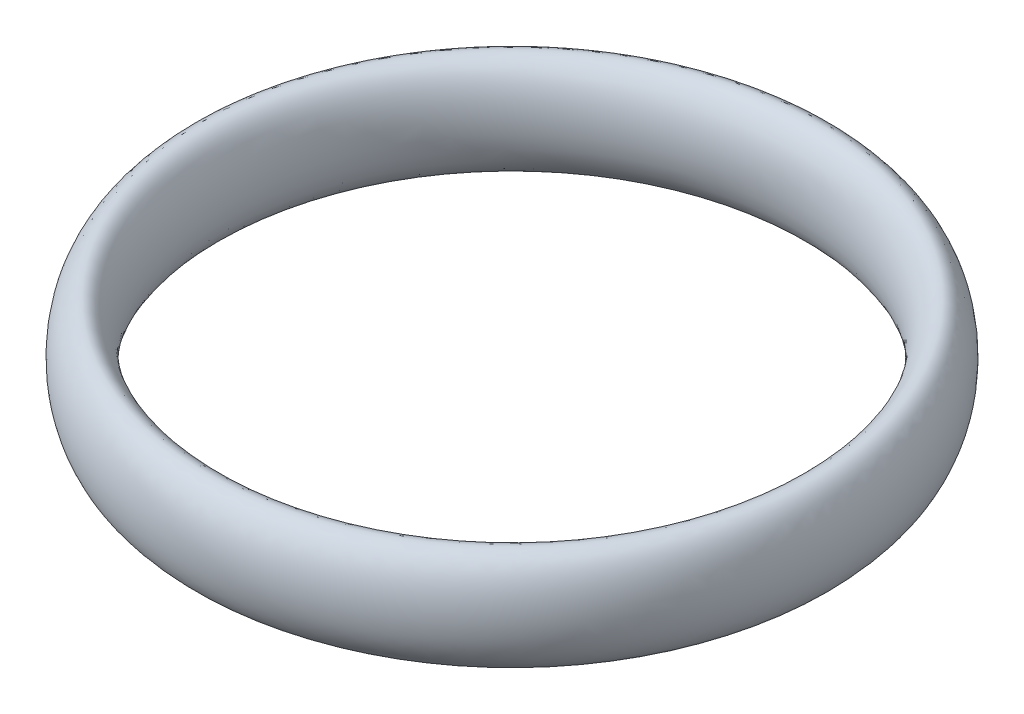
ISO-10303-21;
HEADER;
FILE_DESCRIPTION(('STEP AP214'),'2;1');
FILE_NAME('part.step','',(''),(''),'','','');
FILE_SCHEMA(('AUTOMOTIVE_DESIGN { 1 0 10303 214 1 1 1 1 }'));
ENDSEC;
DATA;
#1=APPLICATION_CONTEXT('core data for automotive mechanical design processes');
#2=APPLICATION_PROTOCOL_DEFINITION('international standard','automotive_design',2000,#1);
#3=PRODUCT_CONTEXT('',#1,'mechanical');
#4=PRODUCT('Part','Part','',(#3));
#5=PRODUCT_RELATED_PRODUCT_CATEGORY('part','',(#4));
#6=PRODUCT_DEFINITION_FORMATION('','',#4);
#7=PRODUCT_DEFINITION_CONTEXT('part definition',#1,'design');
#8=PRODUCT_DEFINITION('design','',#6,#7);
#9=PRODUCT_DEFINITION_SHAPE('','',#8);
#10=(LENGTH_UNIT() NAMED_UNIT(*) SI_UNIT(.MILLI.,.METRE.));
#11=(NAMED_UNIT(*) PLANE_ANGLE_UNIT() SI_UNIT($,.RADIAN.));
#12=(NAMED_UNIT(*) SI_UNIT($,.STERADIAN.) SOLID_ANGLE_UNIT());
#13=UNCERTAINTY_MEASURE_WITH_UNIT(LENGTH_MEASURE(1.E-05),#10,'distance_accuracy_value','');
#14=(GEOMETRIC_REPRESENTATION_CONTEXT(3) GLOBAL_UNCERTAINTY_ASSIGNED_CONTEXT((#13)) GLOBAL_UNIT_ASSIGNED_CONTEXT((#10,
#11,#12)) REPRESENTATION_CONTEXT('',''));
#15=CARTESIAN_POINT('',(0.,0.,0.));
#16=DIRECTION('',(0.,0.,1.));
#17=DIRECTION('',(1.,0.,0.));
#18=AXIS2_PLACEMENT_3D('',#15,#16,#17);
#19=CARTESIAN_POINT('',(7.5692,1.26999999999999,0.));
#20=DIRECTION('',(0.,0.,1.));
#21=DIRECTION('',(0.,1.,0.));
#22=AXIS2_PLACEMENT_3D('',#19,#20,#21);
#23=ELLIPSE('',#22,1.27,0.635);
#24=CARTESIAN_POINT('',(0.,0.,0.));
#25=DIRECTION('',(0.,-1.,0.));
#26=AXIS1_PLACEMENT('',#24,#25);
#27=SURFACE_OF_REVOLUTION('',#23,#26);
#28=ADVANCED_FACE('F29',(),#27,.F.);
#29=CLOSED_SHELL('',(#28));
#30=MANIFOLD_SOLID_BREP('B2',#29);
#31=ADVANCED_BREP_SHAPE_REPRESENTATION('',(#18,#30),#14);
#32=SHAPE_DEFINITION_REPRESENTATION(#9,#31);
ENDSEC;
END-ISO-10303-21;
